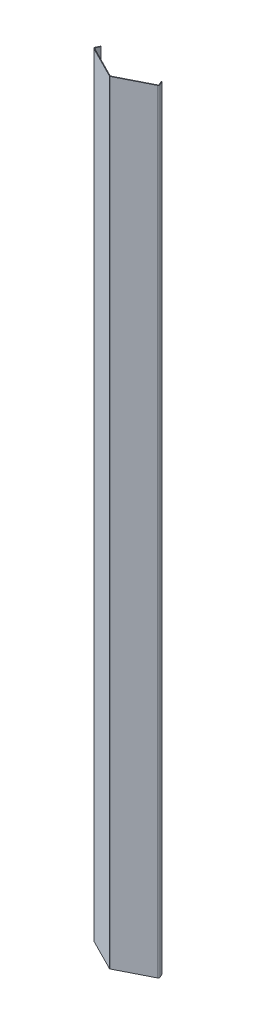
ISO-10303-21;
HEADER;
FILE_DESCRIPTION(('STEP AP214'),'2;1');
FILE_NAME('part.step','',(''),(''),'','','');
FILE_SCHEMA(('AUTOMOTIVE_DESIGN { 1 0 10303 214 1 1 1 1 }'));
ENDSEC;
DATA;
#1=APPLICATION_CONTEXT('core data for automotive mechanical design processes');
#2=APPLICATION_PROTOCOL_DEFINITION('international standard','automotive_design',2000,#1);
#3=PRODUCT_CONTEXT('',#1,'mechanical');
#4=PRODUCT('Part','Part','',(#3));
#5=PRODUCT_RELATED_PRODUCT_CATEGORY('part','',(#4));
#6=PRODUCT_DEFINITION_FORMATION('','',#4);
#7=PRODUCT_DEFINITION_CONTEXT('part definition',#1,'design');
#8=PRODUCT_DEFINITION('design','',#6,#7);
#9=PRODUCT_DEFINITION_SHAPE('','',#8);
#10=(LENGTH_UNIT() NAMED_UNIT(*) SI_UNIT(.MILLI.,.METRE.));
#11=(NAMED_UNIT(*) PLANE_ANGLE_UNIT() SI_UNIT($,.RADIAN.));
#12=(NAMED_UNIT(*) SI_UNIT($,.STERADIAN.) SOLID_ANGLE_UNIT());
#13=UNCERTAINTY_MEASURE_WITH_UNIT(LENGTH_MEASURE(1.E-05),#10,'distance_accuracy_value','');
#14=(GEOMETRIC_REPRESENTATION_CONTEXT(3) GLOBAL_UNCERTAINTY_ASSIGNED_CONTEXT((#13)) GLOBAL_UNIT_ASSIGNED_CONTEXT((#10,
#11,#12)) REPRESENTATION_CONTEXT('',''));
#15=CARTESIAN_POINT('',(0.,0.,0.));
#16=DIRECTION('',(0.,0.,1.));
#17=DIRECTION('',(1.,0.,0.));
#18=AXIS2_PLACEMENT_3D('',#15,#16,#17);
#19=CARTESIAN_POINT('',(-102.841397195583,5330.,-134.965277777778));
#20=DIRECTION('',(-0.409836101706064,0.,0.912159180043909));
#21=DIRECTION('',(0.91215918004391,0.,0.409836101706064));
#22=AXIS2_PLACEMENT_3D('',#19,#20,#21);
#23=PLANE('',#22);
#24=DIRECTION('',(-0.912159180043909,0.,-0.409836101706064));
#25=VECTOR('',#24,1.);
#26=CARTESIAN_POINT('',(-102.841397195583,0.,-134.965277777778));
#27=LINE('',#26,#25);
#28=CARTESIAN_POINT('',(-99.1927604754076,0.,-133.325933370954));
#29=VERTEX_POINT('',#28);
#30=CARTESIAN_POINT('',(-102.841397195583,0.,-134.965277777778));
#31=VERTEX_POINT('',#30);
#32=EDGE_CURVE('E177',#29,#31,#27,.T.);
#33=ORIENTED_EDGE('',*,*,#32,.T.);
#34=DIRECTION('',(0.,-1.,0.));
#35=VECTOR('',#34,1.);
#36=CARTESIAN_POINT('',(-102.841397195583,5330.,-134.965277777778));
#37=LINE('',#36,#35);
#38=CARTESIAN_POINT('',(-102.841397195583,5330.,-134.965277777778));
#39=VERTEX_POINT('',#38);
#40=EDGE_CURVE('E11',#39,#31,#37,.T.);
#41=ORIENTED_EDGE('',*,*,#40,.F.);
#42=DIRECTION('',(-0.912159180043909,0.,-0.409836101706064));
#43=VECTOR('',#42,1.);
#44=CARTESIAN_POINT('',(-102.841397195583,5330.,-134.965277777778));
#45=LINE('',#44,#43);
#46=CARTESIAN_POINT('',(-99.1927604754076,5330.,-133.325933370954));
#47=VERTEX_POINT('',#46);
#48=EDGE_CURVE('E207',#47,#39,#45,.T.);
#49=ORIENTED_EDGE('',*,*,#48,.F.);
#50=DIRECTION('',(0.,-1.,0.));
#51=VECTOR('',#50,1.);
#52=CARTESIAN_POINT('',(-99.1927604754076,5330.,-133.325933370954));
#53=LINE('',#52,#51);
#54=EDGE_CURVE('E173',#47,#29,#53,.T.);
#55=ORIENTED_EDGE('',*,*,#54,.T.);
#56=EDGE_LOOP('',(#33,#41,#49,#55));
#57=FACE_BOUND('',#56,.T.);
#58=ADVANCED_FACE('F33',(#57),#23,.F.);
#59=CARTESIAN_POINT('',(-102.841397195583,5330.,-134.965277777778));
#60=DIRECTION('',(0.91215918004391,0.,0.409836101706063));
#61=DIRECTION('',(0.409836101706063,0.,-0.91215918004391));
#62=AXIS2_PLACEMENT_3D('',#59,#60,#61);
#63=PLANE('',#62);
#64=DIRECTION('',(-0.409836101706063,0.,0.91215918004391));
#65=VECTOR('',#64,1.);
#66=CARTESIAN_POINT('',(-102.841397195583,0.,-134.965277777778));
#67=LINE('',#66,#65);
#68=CARTESIAN_POINT('',(-115.114033485366,0.,-107.65046141957));
#69=VERTEX_POINT('',#68);
#70=EDGE_CURVE('E180',#31,#69,#67,.T.);
#71=ORIENTED_EDGE('',*,*,#70,.T.);
#72=DIRECTION('',(0.,-1.,0.));
#73=VECTOR('',#72,1.);
#74=CARTESIAN_POINT('',(-115.114033485366,5330.,-107.65046141957));
#75=LINE('',#74,#73);
#76=CARTESIAN_POINT('',(-115.114033485366,5330.,-107.65046141957));
#77=VERTEX_POINT('',#76);
#78=EDGE_CURVE('E41',#77,#69,#75,.T.);
#79=ORIENTED_EDGE('',*,*,#78,.F.);
#80=DIRECTION('',(-0.409836101706063,0.,0.91215918004391));
#81=VECTOR('',#80,1.);
#82=CARTESIAN_POINT('',(-102.841397195583,5330.,-134.965277777778));
#83=LINE('',#82,#81);
#84=EDGE_CURVE('E116',#39,#77,#83,.T.);
#85=ORIENTED_EDGE('',*,*,#84,.F.);
#86=ORIENTED_EDGE('',*,*,#40,.T.);
#87=EDGE_LOOP('',(#71,#79,#85,#86));
#88=FACE_BOUND('',#87,.T.);
#89=ADVANCED_FACE('F305',(#88),#63,.F.);
#90=CARTESIAN_POINT('',(-105.992441684927,5330.,-103.552100402509));
#91=DIRECTION('',(0.,-1.,0.));
#92=DIRECTION('',(0.,0.,-1.));
#93=AXIS2_PLACEMENT_3D('',#90,#91,#92);
#94=CYLINDRICAL_SURFACE('',#93,10.);
#95=CARTESIAN_POINT('',(-105.992441684927,0.,-103.552100402509));
#96=DIRECTION('',(0.,1.,0.));
#97=DIRECTION('',(0.,0.,1.));
#98=AXIS2_PLACEMENT_3D('',#95,#96,#97);
#99=CIRCLE('',#98,10.);
#100=CARTESIAN_POINT('',(-110.511946464936,0.,-94.6316701133653));
#101=VERTEX_POINT('',#100);
#102=EDGE_CURVE('E182',#69,#101,#99,.T.);
#103=ORIENTED_EDGE('',*,*,#102,.T.);
#104=DIRECTION('',(0.,-1.,0.));
#105=VECTOR('',#104,1.);
#106=CARTESIAN_POINT('',(-110.511946464936,5330.,-94.6316701133653));
#107=LINE('',#106,#105);
#108=CARTESIAN_POINT('',(-110.511946464936,5330.,-94.6316701133653));
#109=VERTEX_POINT('',#108);
#110=EDGE_CURVE('E238',#109,#101,#107,.T.);
#111=ORIENTED_EDGE('',*,*,#110,.F.);
#112=CARTESIAN_POINT('',(-105.992441684927,5330.,-103.552100402509));
#113=DIRECTION('',(0.,1.,0.));
#114=DIRECTION('',(0.,0.,1.));
#115=AXIS2_PLACEMENT_3D('',#112,#113,#114);
#116=CIRCLE('',#115,10.);
#117=EDGE_CURVE('E246',#77,#109,#116,.T.);
#118=ORIENTED_EDGE('',*,*,#117,.F.);
#119=ORIENTED_EDGE('',*,*,#78,.T.);
#120=EDGE_LOOP('',(#103,#111,#118,#119));
#121=FACE_BOUND('',#120,.T.);
#122=ADVANCED_FACE('F244',(#121),#94,.T.);
#123=CARTESIAN_POINT('',(103.67090773331,5330.,13.8833232186408));
#124=DIRECTION('',(0.451950478000949,0.,-0.892043028914365));
#125=DIRECTION('',(-0.892043028914365,0.,-0.451950478000949));
#126=AXIS2_PLACEMENT_3D('',#123,#124,#125);
#127=PLANE('',#126);
#128=DIRECTION('',(0.892043028914365,0.,0.451950478000949));
#129=VECTOR('',#128,1.);
#130=CARTESIAN_POINT('',(103.67090773331,0.,13.8833232186408));
#131=LINE('',#130,#129);
#132=CARTESIAN_POINT('',(103.67090773331,0.,13.8833232186408));
#133=VERTEX_POINT('',#132);
#134=EDGE_CURVE('E184',#101,#133,#131,.T.);
#135=ORIENTED_EDGE('',*,*,#134,.T.);
#136=DIRECTION('',(0.,-1.,0.));
#137=VECTOR('',#136,1.);
#138=CARTESIAN_POINT('',(103.67090773331,5330.,13.8833232186408));
#139=LINE('',#138,#137);
#140=CARTESIAN_POINT('',(103.67090773331,5330.,13.8833232186408));
#141=VERTEX_POINT('',#140);
#142=EDGE_CURVE('E235',#141,#133,#139,.T.);
#143=ORIENTED_EDGE('',*,*,#142,.F.);
#144=DIRECTION('',(0.892043028914365,0.,0.451950478000949));
#145=VECTOR('',#144,1.);
#146=CARTESIAN_POINT('',(103.67090773331,5330.,13.8833232186408));
#147=LINE('',#146,#145);
#148=EDGE_CURVE('E264',#109,#141,#147,.T.);
#149=ORIENTED_EDGE('',*,*,#148,.F.);
#150=ORIENTED_EDGE('',*,*,#110,.T.);
#151=EDGE_LOOP('',(#135,#143,#149,#150));
#152=FACE_BOUND('',#151,.T.);
#153=ADVANCED_FACE('F255',(#152),#127,.F.);
#154=CARTESIAN_POINT('',(108.19041251332,5330.,4.96289292949717));
#155=DIRECTION('',(0.,-1.,0.));
#156=DIRECTION('',(0.,0.,-1.));
#157=AXIS2_PLACEMENT_3D('',#154,#155,#156);
#158=CYLINDRICAL_SURFACE('',#157,10.);
#159=CARTESIAN_POINT('',(108.19041251332,0.,4.96289292949717));
#160=DIRECTION('',(0.,1.,0.));
#161=DIRECTION('',(0.,0.,1.));
#162=AXIS2_PLACEMENT_3D('',#159,#160,#161);
#163=CIRCLE('',#162,10.);
#164=CARTESIAN_POINT('',(112.709917293329,0.,13.8833232186408));
#165=VERTEX_POINT('',#164);
#166=EDGE_CURVE('E186',#133,#165,#163,.T.);
#167=ORIENTED_EDGE('',*,*,#166,.T.);
#168=DIRECTION('',(0.,-1.,0.));
#169=VECTOR('',#168,1.);
#170=CARTESIAN_POINT('',(112.709917293329,5330.,13.8833232186408));
#171=LINE('',#170,#169);
#172=CARTESIAN_POINT('',(112.709917293329,5330.,13.8833232186408));
#173=VERTEX_POINT('',#172);
#174=EDGE_CURVE('E232',#173,#165,#171,.T.);
#175=ORIENTED_EDGE('',*,*,#174,.F.);
#176=CARTESIAN_POINT('',(108.19041251332,5330.,4.96289292949717));
#177=DIRECTION('',(0.,1.,0.));
#178=DIRECTION('',(0.,0.,1.));
#179=AXIS2_PLACEMENT_3D('',#176,#177,#178);
#180=CIRCLE('',#179,10.);
#181=EDGE_CURVE('E261',#141,#173,#180,.T.);
#182=ORIENTED_EDGE('',*,*,#181,.F.);
#183=ORIENTED_EDGE('',*,*,#142,.T.);
#184=EDGE_LOOP('',(#167,#175,#182,#183));
#185=FACE_BOUND('',#184,.T.);
#186=ADVANCED_FACE('F259',(#185),#158,.T.);
#187=CARTESIAN_POINT('',(112.709917293329,5330.,13.8833232186408));
#188=DIRECTION('',(-0.451950478000949,0.,-0.892043028914365));
#189=DIRECTION('',(-0.892043028914365,0.,0.451950478000949));
#190=AXIS2_PLACEMENT_3D('',#187,#188,#189);
#191=PLANE('',#190);
#192=DIRECTION('',(0.892043028914365,0.,-0.451950478000949));
#193=VECTOR('',#192,1.);
#194=CARTESIAN_POINT('',(112.709917293329,0.,13.8833232186408));
#195=LINE('',#194,#193);
#196=CARTESIAN_POINT('',(326.892771491575,0.,-94.6316701133653));
#197=VERTEX_POINT('',#196);
#198=EDGE_CURVE('E188',#165,#197,#195,.T.);
#199=ORIENTED_EDGE('',*,*,#198,.T.);
#200=DIRECTION('',(0.,-1.,0.));
#201=VECTOR('',#200,1.);
#202=CARTESIAN_POINT('',(326.892771491575,5330.,-94.6316701133653));
#203=LINE('',#202,#201);
#204=CARTESIAN_POINT('',(326.892771491575,5330.,-94.6316701133653));
#205=VERTEX_POINT('',#204);
#206=EDGE_CURVE('E229',#205,#197,#203,.T.);
#207=ORIENTED_EDGE('',*,*,#206,.F.);
#208=DIRECTION('',(0.892043028914365,0.,-0.451950478000949));
#209=VECTOR('',#208,1.);
#210=CARTESIAN_POINT('',(112.709917293329,5330.,13.8833232186408));
#211=LINE('',#210,#209);
#212=EDGE_CURVE('E263',#173,#205,#211,.T.);
#213=ORIENTED_EDGE('',*,*,#212,.F.);
#214=ORIENTED_EDGE('',*,*,#174,.T.);
#215=EDGE_LOOP('',(#199,#207,#213,#214));
#216=FACE_BOUND('',#215,.T.);
#217=ADVANCED_FACE('F318',(#216),#191,.F.);
#218=CARTESIAN_POINT('',(322.373266711566,5330.,-103.552100402509));
#219=DIRECTION('',(0.,-1.,0.));
#220=DIRECTION('',(0.,0.,-1.));
#221=AXIS2_PLACEMENT_3D('',#218,#219,#220);
#222=CYLINDRICAL_SURFACE('',#221,10.);
#223=CARTESIAN_POINT('',(322.373266711566,0.,-103.552100402509));
#224=DIRECTION('',(0.,1.,0.));
#225=DIRECTION('',(0.,0.,-1.));
#226=AXIS2_PLACEMENT_3D('',#223,#224,#225);
#227=CIRCLE('',#226,10.);
#228=CARTESIAN_POINT('',(331.494858512005,0.,-107.65046141957));
#229=VERTEX_POINT('',#228);
#230=EDGE_CURVE('E190',#197,#229,#227,.T.);
#231=ORIENTED_EDGE('',*,*,#230,.T.);
#232=DIRECTION('',(0.,-1.,0.));
#233=VECTOR('',#232,1.);
#234=CARTESIAN_POINT('',(331.494858512005,5330.,-107.65046141957));
#235=LINE('',#234,#233);
#236=CARTESIAN_POINT('',(331.494858512005,5330.,-107.65046141957));
#237=VERTEX_POINT('',#236);
#238=EDGE_CURVE('E226',#237,#229,#235,.T.);
#239=ORIENTED_EDGE('',*,*,#238,.F.);
#240=CARTESIAN_POINT('',(322.373266711566,5330.,-103.552100402509));
#241=DIRECTION('',(0.,1.,0.));
#242=DIRECTION('',(0.,0.,-1.));
#243=AXIS2_PLACEMENT_3D('',#240,#241,#242);
#244=CIRCLE('',#243,10.);
#245=EDGE_CURVE('E266',#205,#237,#244,.T.);
#246=ORIENTED_EDGE('',*,*,#245,.F.);
#247=ORIENTED_EDGE('',*,*,#206,.T.);
#248=EDGE_LOOP('',(#231,#239,#246,#247));
#249=FACE_BOUND('',#248,.T.);
#250=ADVANCED_FACE('F321',(#249),#222,.T.);
#251=CARTESIAN_POINT('',(319.222222222222,5330.,-134.965277777778));
#252=DIRECTION('',(-0.91215918004391,0.,0.409836101706063));
#253=DIRECTION('',(0.409836101706063,0.,0.91215918004391));
#254=AXIS2_PLACEMENT_3D('',#251,#252,#253);
#255=PLANE('',#254);
#256=DIRECTION('',(-0.409836101706063,0.,-0.91215918004391));
#257=VECTOR('',#256,1.);
#258=CARTESIAN_POINT('',(319.222222222222,0.,-134.965277777778));
#259=LINE('',#258,#257);
#260=CARTESIAN_POINT('',(319.222222222222,0.,-134.965277777778));
#261=VERTEX_POINT('',#260);
#262=EDGE_CURVE('E192',#229,#261,#259,.T.);
#263=ORIENTED_EDGE('',*,*,#262,.T.);
#264=DIRECTION('',(0.,-1.,0.));
#265=VECTOR('',#264,1.);
#266=CARTESIAN_POINT('',(319.222222222222,5330.,-134.965277777778));
#267=LINE('',#266,#265);
#268=CARTESIAN_POINT('',(319.222222222222,5330.,-134.965277777778));
#269=VERTEX_POINT('',#268);
#270=EDGE_CURVE('E223',#269,#261,#267,.T.);
#271=ORIENTED_EDGE('',*,*,#270,.F.);
#272=DIRECTION('',(-0.409836101706063,0.,-0.91215918004391));
#273=VECTOR('',#272,1.);
#274=CARTESIAN_POINT('',(319.222222222222,5330.,-134.965277777778));
#275=LINE('',#274,#273);
#276=EDGE_CURVE('E272',#237,#269,#275,.T.);
#277=ORIENTED_EDGE('',*,*,#276,.F.);
#278=ORIENTED_EDGE('',*,*,#238,.T.);
#279=EDGE_LOOP('',(#263,#271,#277,#278));
#280=FACE_BOUND('',#279,.T.);
#281=ADVANCED_FACE('F325',(#280),#255,.F.);
#282=CARTESIAN_POINT('',(319.222222222222,5330.,-134.965277777778));
#283=DIRECTION('',(0.409836101706065,0.,0.912159180043909));
#284=DIRECTION('',(0.912159180043909,0.,-0.409836101706065));
#285=AXIS2_PLACEMENT_3D('',#282,#283,#284);
#286=PLANE('',#285);
#287=DIRECTION('',(-0.912159180043909,0.,0.409836101706065));
#288=VECTOR('',#287,1.);
#289=CARTESIAN_POINT('',(319.222222222222,0.,-134.965277777778));
#290=LINE('',#289,#288);
#291=CARTESIAN_POINT('',(315.573585502047,0.,-133.325933370954));
#292=VERTEX_POINT('',#291);
#293=EDGE_CURVE('E194',#261,#292,#290,.T.);
#294=ORIENTED_EDGE('',*,*,#293,.T.);
#295=DIRECTION('',(0.,-1.,0.));
#296=VECTOR('',#295,1.);
#297=CARTESIAN_POINT('',(315.573585502047,5330.,-133.325933370954));
#298=LINE('',#297,#296);
#299=CARTESIAN_POINT('',(315.573585502047,5330.,-133.325933370954));
#300=VERTEX_POINT('',#299);
#301=EDGE_CURVE('E220',#300,#292,#298,.T.);
#302=ORIENTED_EDGE('',*,*,#301,.F.);
#303=DIRECTION('',(-0.912159180043909,0.,0.409836101706065));
#304=VECTOR('',#303,1.);
#305=CARTESIAN_POINT('',(319.222222222222,5330.,-134.965277777778));
#306=LINE('',#305,#304);
#307=EDGE_CURVE('E274',#269,#300,#306,.T.);
#308=ORIENTED_EDGE('',*,*,#307,.F.);
#309=ORIENTED_EDGE('',*,*,#270,.T.);
#310=EDGE_LOOP('',(#294,#302,#308,#309));
#311=FACE_BOUND('',#310,.T.);
#312=ADVANCED_FACE('F329',(#311),#286,.F.);
#313=CARTESIAN_POINT('',(315.573585502047,5330.,-133.325933370954));
#314=DIRECTION('',(0.91215918004391,0.,-0.409836101706063));
#315=DIRECTION('',(-0.409836101706063,0.,-0.91215918004391));
#316=AXIS2_PLACEMENT_3D('',#313,#314,#315);
#317=PLANE('',#316);
#318=DIRECTION('',(0.409836101706063,0.,0.91215918004391));
#319=VECTOR('',#318,1.);
#320=CARTESIAN_POINT('',(315.573585502047,0.,-133.325933370954));
#321=LINE('',#320,#319);
#322=CARTESIAN_POINT('',(327.846221791829,0.,-106.011117012745));
#323=VERTEX_POINT('',#322);
#324=EDGE_CURVE('E196',#292,#323,#321,.T.);
#325=ORIENTED_EDGE('',*,*,#324,.T.);
#326=DIRECTION('',(0.,-1.,0.));
#327=VECTOR('',#326,1.);
#328=CARTESIAN_POINT('',(327.846221791829,5330.,-106.011117012745));
#329=LINE('',#328,#327);
#330=CARTESIAN_POINT('',(327.846221791829,5330.,-106.011117012745));
#331=VERTEX_POINT('',#330);
#332=EDGE_CURVE('E217',#331,#323,#329,.T.);
#333=ORIENTED_EDGE('',*,*,#332,.F.);
#334=DIRECTION('',(0.409836101706063,0.,0.91215918004391));
#335=VECTOR('',#334,1.);
#336=CARTESIAN_POINT('',(315.573585502047,5330.,-133.325933370954));
#337=LINE('',#336,#335);
#338=EDGE_CURVE('E276',#300,#331,#337,.T.);
#339=ORIENTED_EDGE('',*,*,#338,.F.);
#340=ORIENTED_EDGE('',*,*,#301,.T.);
#341=EDGE_LOOP('',(#325,#333,#339,#340));
#342=FACE_BOUND('',#341,.T.);
#343=ADVANCED_FACE('F333',(#342),#317,.F.);
#344=CARTESIAN_POINT('',(322.373266711566,5330.,-103.552100402509));
#345=DIRECTION('',(0.,-1.,0.));
#346=DIRECTION('',(0.,0.,-1.));
#347=AXIS2_PLACEMENT_3D('',#344,#345,#346);
#348=CYLINDRICAL_SURFACE('',#347,6.);
#349=CARTESIAN_POINT('',(322.373266711566,0.,-103.552100402509));
#350=DIRECTION('',(0.,-1.,0.));
#351=DIRECTION('',(0.,0.,-1.));
#352=AXIS2_PLACEMENT_3D('',#349,#350,#351);
#353=CIRCLE('',#352,6.);
#354=CARTESIAN_POINT('',(325.084969579571,0.,-98.1998422290227));
#355=VERTEX_POINT('',#354);
#356=EDGE_CURVE('E198',#323,#355,#353,.T.);
#357=ORIENTED_EDGE('',*,*,#356,.T.);
#358=DIRECTION('',(0.,-1.,0.));
#359=VECTOR('',#358,1.);
#360=CARTESIAN_POINT('',(325.084969579571,5330.,-98.1998422290227));
#361=LINE('',#360,#359);
#362=CARTESIAN_POINT('',(325.084969579571,5330.,-98.1998422290227));
#363=VERTEX_POINT('',#362);
#364=EDGE_CURVE('E214',#363,#355,#361,.T.);
#365=ORIENTED_EDGE('',*,*,#364,.F.);
#366=CARTESIAN_POINT('',(322.373266711566,5330.,-103.552100402509));
#367=DIRECTION('',(0.,-1.,0.));
#368=DIRECTION('',(0.,0.,-1.));
#369=AXIS2_PLACEMENT_3D('',#366,#367,#368);
#370=CIRCLE('',#369,6.);
#371=EDGE_CURVE('E278',#331,#363,#370,.T.);
#372=ORIENTED_EDGE('',*,*,#371,.F.);
#373=ORIENTED_EDGE('',*,*,#332,.T.);
#374=EDGE_LOOP('',(#357,#365,#372,#373));
#375=FACE_BOUND('',#374,.T.);
#376=ADVANCED_FACE('F337',(#375),#348,.F.);
#377=CARTESIAN_POINT('',(110.902115381325,5330.,10.3151511029834));
#378=DIRECTION('',(0.451950478000949,0.,0.892043028914365));
#379=DIRECTION('',(0.892043028914365,0.,-0.451950478000949));
#380=AXIS2_PLACEMENT_3D('',#377,#378,#379);
#381=PLANE('',#380);
#382=DIRECTION('',(-0.892043028914365,0.,0.451950478000949));
#383=VECTOR('',#382,1.);
#384=CARTESIAN_POINT('',(110.902115381325,0.,10.3151511029834));
#385=LINE('',#384,#383);
#386=CARTESIAN_POINT('',(110.902115381325,0.,10.3151511029834));
#387=VERTEX_POINT('',#386);
#388=EDGE_CURVE('E200',#355,#387,#385,.T.);
#389=ORIENTED_EDGE('',*,*,#388,.T.);
#390=DIRECTION('',(0.,-1.,0.));
#391=VECTOR('',#390,1.);
#392=CARTESIAN_POINT('',(110.902115381325,5330.,10.3151511029834));
#393=LINE('',#392,#391);
#394=CARTESIAN_POINT('',(110.902115381325,5330.,10.3151511029834));
#395=VERTEX_POINT('',#394);
#396=EDGE_CURVE('E211',#395,#387,#393,.T.);
#397=ORIENTED_EDGE('',*,*,#396,.F.);
#398=DIRECTION('',(-0.892043028914365,0.,0.451950478000949));
#399=VECTOR('',#398,1.);
#400=CARTESIAN_POINT('',(110.902115381325,5330.,10.3151511029834));
#401=LINE('',#400,#399);
#402=EDGE_CURVE('E280',#363,#395,#401,.T.);
#403=ORIENTED_EDGE('',*,*,#402,.F.);
#404=ORIENTED_EDGE('',*,*,#364,.T.);
#405=EDGE_LOOP('',(#389,#397,#403,#404));
#406=FACE_BOUND('',#405,.T.);
#407=ADVANCED_FACE('F286',(#406),#381,.F.);
#408=CARTESIAN_POINT('',(108.19041251332,5330.,4.96289292949717));
#409=DIRECTION('',(0.,-1.,0.));
#410=DIRECTION('',(0.,0.,-1.));
#411=AXIS2_PLACEMENT_3D('',#408,#409,#410);
#412=CYLINDRICAL_SURFACE('',#411,6.00000000000002);
#413=CARTESIAN_POINT('',(108.19041251332,0.,4.96289292949717));
#414=DIRECTION('',(0.,-1.,0.));
#415=DIRECTION('',(0.,0.,1.));
#416=AXIS2_PLACEMENT_3D('',#413,#414,#415);
#417=CIRCLE('',#416,6.00000000000002);
#418=CARTESIAN_POINT('',(105.478709645314,0.,10.3151511029834));
#419=VERTEX_POINT('',#418);
#420=EDGE_CURVE('E202',#387,#419,#417,.T.);
#421=ORIENTED_EDGE('',*,*,#420,.T.);
#422=DIRECTION('',(0.,-1.,0.));
#423=VECTOR('',#422,1.);
#424=CARTESIAN_POINT('',(105.478709645314,5330.,10.3151511029834));
#425=LINE('',#424,#423);
#426=CARTESIAN_POINT('',(105.478709645314,5330.,10.3151511029834));
#427=VERTEX_POINT('',#426);
#428=EDGE_CURVE('E168',#427,#419,#425,.T.);
#429=ORIENTED_EDGE('',*,*,#428,.F.);
#430=CARTESIAN_POINT('',(108.19041251332,5330.,4.96289292949717));
#431=DIRECTION('',(0.,-1.,0.));
#432=DIRECTION('',(0.,0.,1.));
#433=AXIS2_PLACEMENT_3D('',#430,#431,#432);
#434=CIRCLE('',#433,6.00000000000002);
#435=EDGE_CURVE('E159',#395,#427,#434,.T.);
#436=ORIENTED_EDGE('',*,*,#435,.F.);
#437=ORIENTED_EDGE('',*,*,#396,.T.);
#438=EDGE_LOOP('',(#421,#429,#436,#437));
#439=FACE_BOUND('',#438,.T.);
#440=ADVANCED_FACE('F290',(#439),#412,.F.);
#441=CARTESIAN_POINT('',(105.478709645314,5330.,10.3151511029834));
#442=DIRECTION('',(-0.451950478000949,0.,0.892043028914365));
#443=DIRECTION('',(0.892043028914365,0.,0.451950478000949));
#444=AXIS2_PLACEMENT_3D('',#441,#442,#443);
#445=PLANE('',#444);
#446=DIRECTION('',(-0.892043028914365,0.,-0.451950478000949));
#447=VECTOR('',#446,1.);
#448=CARTESIAN_POINT('',(105.478709645314,0.,10.3151511029834));
#449=LINE('',#448,#447);
#450=CARTESIAN_POINT('',(-108.704144552932,0.,-98.1998422290227));
#451=VERTEX_POINT('',#450);
#452=EDGE_CURVE('E167',#419,#451,#449,.T.);
#453=ORIENTED_EDGE('',*,*,#452,.T.);
#454=DIRECTION('',(0.,-1.,0.));
#455=VECTOR('',#454,1.);
#456=CARTESIAN_POINT('',(-108.704144552932,5330.,-98.1998422290227));
#457=LINE('',#456,#455);
#458=CARTESIAN_POINT('',(-108.704144552932,5330.,-98.1998422290227));
#459=VERTEX_POINT('',#458);
#460=EDGE_CURVE('E164',#459,#451,#457,.T.);
#461=ORIENTED_EDGE('',*,*,#460,.F.);
#462=DIRECTION('',(-0.892043028914365,0.,-0.451950478000949));
#463=VECTOR('',#462,1.);
#464=CARTESIAN_POINT('',(105.478709645314,5330.,10.3151511029834));
#465=LINE('',#464,#463);
#466=EDGE_CURVE('E153',#427,#459,#465,.T.);
#467=ORIENTED_EDGE('',*,*,#466,.F.);
#468=ORIENTED_EDGE('',*,*,#428,.T.);
#469=EDGE_LOOP('',(#453,#461,#467,#468));
#470=FACE_BOUND('',#469,.T.);
#471=ADVANCED_FACE('F165',(#470),#445,.F.);
#472=CARTESIAN_POINT('',(-105.992441684927,5330.,-103.552100402509));
#473=DIRECTION('',(0.,-1.,0.));
#474=DIRECTION('',(0.,0.,-1.));
#475=AXIS2_PLACEMENT_3D('',#472,#473,#474);
#476=CYLINDRICAL_SURFACE('',#475,5.99999999999999);
#477=CARTESIAN_POINT('',(-105.992441684927,0.,-103.552100402509));
#478=DIRECTION('',(0.,-1.,0.));
#479=DIRECTION('',(0.,0.,1.));
#480=AXIS2_PLACEMENT_3D('',#477,#478,#479);
#481=CIRCLE('',#480,5.99999999999999);
#482=CARTESIAN_POINT('',(-111.46539676519,0.,-106.011117012745));
#483=VERTEX_POINT('',#482);
#484=EDGE_CURVE('E102',#451,#483,#481,.T.);
#485=ORIENTED_EDGE('',*,*,#484,.T.);
#486=DIRECTION('',(0.,-1.,0.));
#487=VECTOR('',#486,1.);
#488=CARTESIAN_POINT('',(-111.46539676519,5330.,-106.011117012745));
#489=LINE('',#488,#487);
#490=CARTESIAN_POINT('',(-111.46539676519,5330.,-106.011117012745));
#491=VERTEX_POINT('',#490);
#492=EDGE_CURVE('E169',#491,#483,#489,.T.);
#493=ORIENTED_EDGE('',*,*,#492,.F.);
#494=CARTESIAN_POINT('',(-105.992441684927,5330.,-103.552100402509));
#495=DIRECTION('',(0.,-1.,0.));
#496=DIRECTION('',(0.,0.,1.));
#497=AXIS2_PLACEMENT_3D('',#494,#495,#496);
#498=CIRCLE('',#497,5.99999999999999);
#499=EDGE_CURVE('E157',#459,#491,#498,.T.);
#500=ORIENTED_EDGE('',*,*,#499,.F.);
#501=ORIENTED_EDGE('',*,*,#460,.T.);
#502=EDGE_LOOP('',(#485,#493,#500,#501));
#503=FACE_BOUND('',#502,.T.);
#504=ADVANCED_FACE('F171',(#503),#476,.F.);
#505=CARTESIAN_POINT('',(-99.1927604754076,5330.,-133.325933370954));
#506=DIRECTION('',(-0.91215918004391,0.,-0.409836101706063));
#507=DIRECTION('',(-0.409836101706063,0.,0.91215918004391));
#508=AXIS2_PLACEMENT_3D('',#505,#506,#507);
#509=PLANE('',#508);
#510=DIRECTION('',(0.409836101706063,0.,-0.91215918004391));
#511=VECTOR('',#510,1.);
#512=CARTESIAN_POINT('',(-99.1927604754076,0.,-133.325933370954));
#513=LINE('',#512,#511);
#514=EDGE_CURVE('E108',#483,#29,#513,.T.);
#515=ORIENTED_EDGE('',*,*,#514,.T.);
#516=ORIENTED_EDGE('',*,*,#54,.F.);
#517=DIRECTION('',(0.409836101706063,0.,-0.91215918004391));
#518=VECTOR('',#517,1.);
#519=CARTESIAN_POINT('',(-99.1927604754076,5330.,-133.325933370954));
#520=LINE('',#519,#518);
#521=EDGE_CURVE('E49',#491,#47,#520,.T.);
#522=ORIENTED_EDGE('',*,*,#521,.F.);
#523=ORIENTED_EDGE('',*,*,#492,.T.);
#524=EDGE_LOOP('',(#515,#516,#522,#523));
#525=FACE_BOUND('',#524,.T.);
#526=ADVANCED_FACE('F294',(#525),#509,.F.);
#527=CARTESIAN_POINT('',(-105.992441684927,5330.,-103.552100402509));
#528=DIRECTION('',(0.,1.,0.));
#529=DIRECTION('',(0.,0.,1.));
#530=AXIS2_PLACEMENT_3D('',#527,#528,#529);
#531=PLANE('',#530);
#532=ORIENTED_EDGE('',*,*,#48,.T.);
#533=ORIENTED_EDGE('',*,*,#84,.T.);
#534=ORIENTED_EDGE('',*,*,#117,.T.);
#535=ORIENTED_EDGE('',*,*,#148,.T.);
#536=ORIENTED_EDGE('',*,*,#181,.T.);
#537=ORIENTED_EDGE('',*,*,#212,.T.);
#538=ORIENTED_EDGE('',*,*,#245,.T.);
#539=ORIENTED_EDGE('',*,*,#276,.T.);
#540=ORIENTED_EDGE('',*,*,#307,.T.);
#541=ORIENTED_EDGE('',*,*,#338,.T.);
#542=ORIENTED_EDGE('',*,*,#371,.T.);
#543=ORIENTED_EDGE('',*,*,#402,.T.);
#544=ORIENTED_EDGE('',*,*,#435,.T.);
#545=ORIENTED_EDGE('',*,*,#466,.T.);
#546=ORIENTED_EDGE('',*,*,#499,.T.);
#547=ORIENTED_EDGE('',*,*,#521,.T.);
#548=EDGE_LOOP('',(#532,#533,#534,#535,#536,#537,#538,#539,#540,#541,#542,#543,#544,#545,#546,#547));
#549=FACE_BOUND('',#548,.T.);
#550=ADVANCED_FACE('F155',(#549),#531,.T.);
#551=CARTESIAN_POINT('',(-105.992441684927,0.,-103.552100402509));
#552=DIRECTION('',(0.,1.,0.));
#553=DIRECTION('',(0.,0.,1.));
#554=AXIS2_PLACEMENT_3D('',#551,#552,#553);
#555=PLANE('',#554);
#556=ORIENTED_EDGE('',*,*,#32,.F.);
#557=ORIENTED_EDGE('',*,*,#514,.F.);
#558=ORIENTED_EDGE('',*,*,#484,.F.);
#559=ORIENTED_EDGE('',*,*,#452,.F.);
#560=ORIENTED_EDGE('',*,*,#420,.F.);
#561=ORIENTED_EDGE('',*,*,#388,.F.);
#562=ORIENTED_EDGE('',*,*,#356,.F.);
#563=ORIENTED_EDGE('',*,*,#324,.F.);
#564=ORIENTED_EDGE('',*,*,#293,.F.);
#565=ORIENTED_EDGE('',*,*,#262,.F.);
#566=ORIENTED_EDGE('',*,*,#230,.F.);
#567=ORIENTED_EDGE('',*,*,#198,.F.);
#568=ORIENTED_EDGE('',*,*,#166,.F.);
#569=ORIENTED_EDGE('',*,*,#134,.F.);
#570=ORIENTED_EDGE('',*,*,#102,.F.);
#571=ORIENTED_EDGE('',*,*,#70,.F.);
#572=EDGE_LOOP('',(#556,#557,#558,#559,#560,#561,#562,#563,#564,#565,#566,#567,#568,#569,#570,#571));
#573=FACE_BOUND('',#572,.T.);
#574=ADVANCED_FACE('F250',(#573),#555,.F.);
#575=CLOSED_SHELL('',(#58,#89,#122,#153,#186,#217,#250,#281,#312,#343,#376,#407,#440,#471,#504,
#526,#550,#574));
#576=MANIFOLD_SOLID_BREP('B2',#575);
#577=ADVANCED_BREP_SHAPE_REPRESENTATION('',(#18,#576),#14);
#578=SHAPE_DEFINITION_REPRESENTATION(#9,#577);
ENDSEC;
END-ISO-10303-21;
